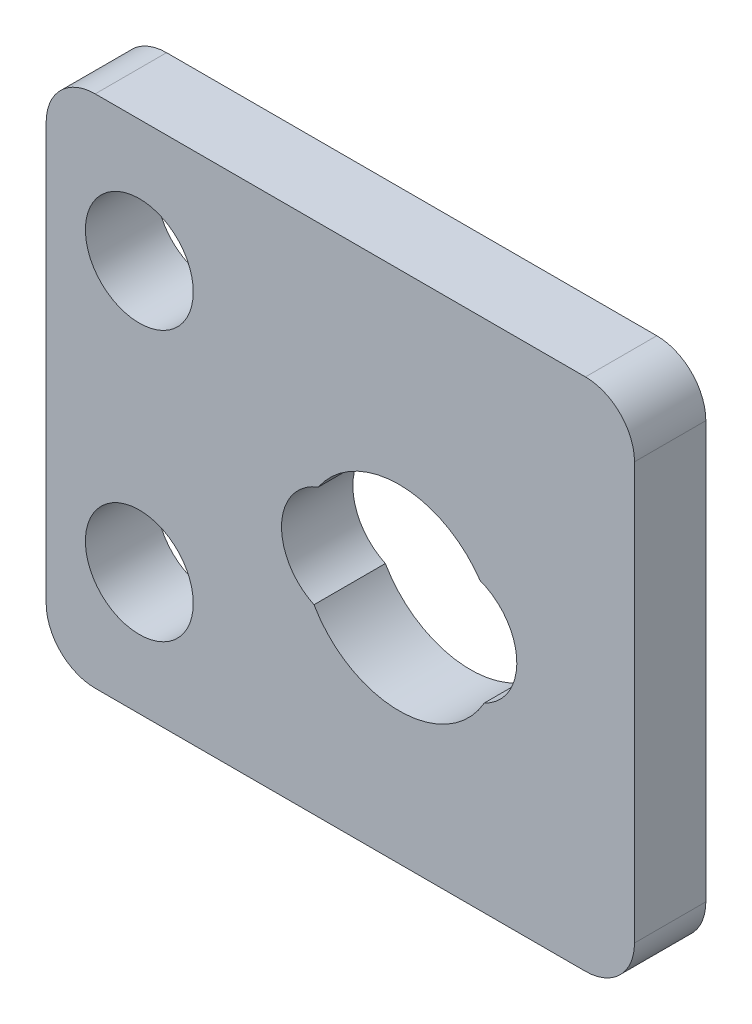
ISO-10303-21;
HEADER;
FILE_DESCRIPTION(('STEP AP214'),'2;1');
FILE_NAME('part.step','',(''),(''),'','','');
FILE_SCHEMA(('AUTOMOTIVE_DESIGN { 1 0 10303 214 1 1 1 1 }'));
ENDSEC;
DATA;
#1=APPLICATION_CONTEXT('core data for automotive mechanical design processes');
#2=APPLICATION_PROTOCOL_DEFINITION('international standard','automotive_design',2000,#1);
#3=PRODUCT_CONTEXT('',#1,'mechanical');
#4=PRODUCT('Part','Part','',(#3));
#5=PRODUCT_RELATED_PRODUCT_CATEGORY('part','',(#4));
#6=PRODUCT_DEFINITION_FORMATION('','',#4);
#7=PRODUCT_DEFINITION_CONTEXT('part definition',#1,'design');
#8=PRODUCT_DEFINITION('design','',#6,#7);
#9=PRODUCT_DEFINITION_SHAPE('','',#8);
#10=(LENGTH_UNIT() NAMED_UNIT(*) SI_UNIT(.MILLI.,.METRE.));
#11=(NAMED_UNIT(*) PLANE_ANGLE_UNIT() SI_UNIT($,.RADIAN.));
#12=(NAMED_UNIT(*) SI_UNIT($,.STERADIAN.) SOLID_ANGLE_UNIT());
#13=UNCERTAINTY_MEASURE_WITH_UNIT(LENGTH_MEASURE(1.E-05),#10,'distance_accuracy_value','');
#14=(GEOMETRIC_REPRESENTATION_CONTEXT(3) GLOBAL_UNCERTAINTY_ASSIGNED_CONTEXT((#13)) GLOBAL_UNIT_ASSIGNED_CONTEXT((#10,
#11,#12)) REPRESENTATION_CONTEXT('',''));
#15=CARTESIAN_POINT('',(0.,0.,0.));
#16=DIRECTION('',(0.,0.,1.));
#17=DIRECTION('',(1.,0.,0.));
#18=AXIS2_PLACEMENT_3D('',#15,#16,#17);
#19=CARTESIAN_POINT('',(-63.6058315526219,-52.4736097758341,80.3472714906711));
#20=DIRECTION('',(0.,0.,-1.));
#21=DIRECTION('',(-1.,0.,0.));
#22=AXIS2_PLACEMENT_3D('',#19,#20,#21);
#23=PLANE('',#22);
#24=CARTESIAN_POINT('',(-60.1558315526219,-58.2236097758341,80.3472714906711));
#25=DIRECTION('',(0.,0.,1.));
#26=DIRECTION('',(1.,0.,0.));
#27=AXIS2_PLACEMENT_3D('',#24,#25,#26);
#28=CIRCLE('',#27,1.15);
#29=CARTESIAN_POINT('',(-60.557732115266,-57.1461238419369,80.3472714906711));
#30=VERTEX_POINT('',#29);
#31=CARTESIAN_POINT('',(-60.6425092647382,-59.2655525787409,80.3472714906711));
#32=VERTEX_POINT('',#31);
#33=EDGE_CURVE('E133',#30,#32,#28,.T.);
#34=ORIENTED_EDGE('',*,*,#33,.F.);
#35=CARTESIAN_POINT('',(-58.9058315526219,-58.2736097758341,80.3472714906711));
#36=DIRECTION('',(0.,0.,-1.));
#37=DIRECTION('',(-1.,0.,0.));
#38=AXIS2_PLACEMENT_3D('',#35,#36,#37);
#39=CIRCLE('',#38,2.);
#40=CARTESIAN_POINT('',(-57.2539309899778,-57.1461238419369,80.3472714906711));
#41=VERTEX_POINT('',#40);
#42=EDGE_CURVE('E136',#41,#30,#39,.F.);
#43=ORIENTED_EDGE('',*,*,#42,.F.);
#44=CARTESIAN_POINT('',(-57.6558315526219,-58.2236097758341,80.3472714906711));
#45=DIRECTION('',(0.,0.,1.));
#46=DIRECTION('',(1.,0.,0.));
#47=AXIS2_PLACEMENT_3D('',#44,#45,#46);
#48=CIRCLE('',#47,1.15);
#49=CARTESIAN_POINT('',(-57.1691538405056,-59.2655525787409,80.3472714906711));
#50=VERTEX_POINT('',#49);
#51=EDGE_CURVE('E135',#50,#41,#48,.T.);
#52=ORIENTED_EDGE('',*,*,#51,.F.);
#53=EDGE_CURVE('E55',#32,#50,#39,.F.);
#54=ORIENTED_EDGE('',*,*,#53,.F.);
#55=EDGE_LOOP('',(#34,#43,#52,#54));
#56=FACE_BOUND('',#55,.T.);
#57=CARTESIAN_POINT('',(-64.2058315526219,-54.9736097758341,80.3472714906711));
#58=DIRECTION('',(0.,0.,1.));
#59=DIRECTION('',(1.,0.,0.));
#60=AXIS2_PLACEMENT_3D('',#57,#58,#59);
#61=CIRCLE('',#60,1.10000000000001);
#62=CARTESIAN_POINT('',(-63.1058315526219,-54.9736097758341,80.3472714906711));
#63=VERTEX_POINT('',#62);
#64=EDGE_CURVE('E142',#63,#63,#61,.T.);
#65=ORIENTED_EDGE('',*,*,#64,.F.);
#66=EDGE_LOOP('',(#65));
#67=FACE_BOUND('',#66,.T.);
#68=CARTESIAN_POINT('',(-64.2058315526219,-60.4736097758341,80.3472714906711));
#69=DIRECTION('',(0.,0.,1.));
#70=DIRECTION('',(1.,0.,0.));
#71=AXIS2_PLACEMENT_3D('',#68,#69,#70);
#72=CIRCLE('',#71,1.10000000000001);
#73=CARTESIAN_POINT('',(-63.1058315526219,-60.4736097758341,80.3472714906711));
#74=VERTEX_POINT('',#73);
#75=EDGE_CURVE('E151',#74,#74,#72,.T.);
#76=ORIENTED_EDGE('',*,*,#75,.F.);
#77=EDGE_LOOP('',(#76));
#78=FACE_BOUND('',#77,.T.);
#79=DIRECTION('',(1.,0.,0.));
#80=VECTOR('',#79,1.);
#81=CARTESIAN_POINT('',(-63.6058315526219,-62.9736097758341,80.3472714906711));
#82=LINE('',#81,#80);
#83=CARTESIAN_POINT('',(-65.1058315526219,-62.9736097758341,80.3472714906711));
#84=VERTEX_POINT('',#83);
#85=CARTESIAN_POINT('',(-55.1058315526219,-62.9736097758341,80.3472714906711));
#86=VERTEX_POINT('',#85);
#87=EDGE_CURVE('E159',#84,#86,#82,.T.);
#88=ORIENTED_EDGE('',*,*,#87,.T.);
#89=CARTESIAN_POINT('',(-55.1058315526219,-61.9736097758341,80.3472714906711));
#90=DIRECTION('',(0.,0.,-1.));
#91=DIRECTION('',(-1.,0.,0.));
#92=AXIS2_PLACEMENT_3D('',#89,#90,#91);
#93=CIRCLE('',#92,1.);
#94=CARTESIAN_POINT('',(-54.1058315526219,-61.9736097758341,80.3472714906711));
#95=VERTEX_POINT('',#94);
#96=EDGE_CURVE('E184',#86,#95,#93,.F.);
#97=ORIENTED_EDGE('',*,*,#96,.T.);
#98=DIRECTION('',(0.,-1.,0.));
#99=VECTOR('',#98,1.);
#100=CARTESIAN_POINT('',(-54.1058315526219,-52.4736097758341,80.3472714906711));
#101=LINE('',#100,#99);
#102=CARTESIAN_POINT('',(-54.1058315526219,-53.4736097758341,80.3472714906711));
#103=VERTEX_POINT('',#102);
#104=EDGE_CURVE('E163',#103,#95,#101,.T.);
#105=ORIENTED_EDGE('',*,*,#104,.F.);
#106=CARTESIAN_POINT('',(-55.1058315526219,-53.4736097758341,80.3472714906711));
#107=DIRECTION('',(0.,0.,-1.));
#108=DIRECTION('',(-1.,0.,0.));
#109=AXIS2_PLACEMENT_3D('',#106,#107,#108);
#110=CIRCLE('',#109,1.);
#111=CARTESIAN_POINT('',(-55.1058315526219,-52.4736097758341,80.3472714906711));
#112=VERTEX_POINT('',#111);
#113=EDGE_CURVE('E178',#103,#112,#110,.F.);
#114=ORIENTED_EDGE('',*,*,#113,.T.);
#115=DIRECTION('',(1.,0.,0.));
#116=VECTOR('',#115,1.);
#117=CARTESIAN_POINT('',(-63.6058315526219,-52.4736097758341,80.3472714906711));
#118=LINE('',#117,#116);
#119=CARTESIAN_POINT('',(-65.1058315526219,-52.4736097758341,80.3472714906711));
#120=VERTEX_POINT('',#119);
#121=EDGE_CURVE('E160',#120,#112,#118,.T.);
#122=ORIENTED_EDGE('',*,*,#121,.F.);
#123=CARTESIAN_POINT('',(-65.1058315526219,-53.4736097758341,80.3472714906711));
#124=DIRECTION('',(0.,0.,-1.));
#125=DIRECTION('',(-1.,0.,0.));
#126=AXIS2_PLACEMENT_3D('',#123,#124,#125);
#127=CIRCLE('',#126,1.);
#128=CARTESIAN_POINT('',(-66.1058315526219,-53.4736097758341,80.3472714906711));
#129=VERTEX_POINT('',#128);
#130=EDGE_CURVE('E180',#120,#129,#127,.F.);
#131=ORIENTED_EDGE('',*,*,#130,.T.);
#132=DIRECTION('',(0.,1.,0.));
#133=VECTOR('',#132,1.);
#134=CARTESIAN_POINT('',(-66.1058315526219,-52.4736097758341,80.3472714906711));
#135=LINE('',#134,#133);
#136=CARTESIAN_POINT('',(-66.1058315526219,-61.9736097758341,80.3472714906711));
#137=VERTEX_POINT('',#136);
#138=EDGE_CURVE('E154',#137,#129,#135,.T.);
#139=ORIENTED_EDGE('',*,*,#138,.F.);
#140=CARTESIAN_POINT('',(-65.1058315526219,-61.9736097758341,80.3472714906711));
#141=DIRECTION('',(0.,0.,-1.));
#142=DIRECTION('',(-1.,0.,0.));
#143=AXIS2_PLACEMENT_3D('',#140,#141,#142);
#144=CIRCLE('',#143,1.);
#145=EDGE_CURVE('E182',#137,#84,#144,.F.);
#146=ORIENTED_EDGE('',*,*,#145,.T.);
#147=EDGE_LOOP('',(#88,#97,#105,#114,#122,#131,#139,#146));
#148=FACE_BOUND('',#147,.T.);
#149=ADVANCED_FACE('F32',(#56,#67,#78,#148),#23,.F.);
#150=CARTESIAN_POINT('',(-54.1058315526219,-52.4736097758341,76.3472714906711));
#151=DIRECTION('',(-1.,0.,0.));
#152=DIRECTION('',(0.,0.,1.));
#153=AXIS2_PLACEMENT_3D('',#150,#151,#152);
#154=PLANE('',#153);
#155=DIRECTION('',(0.,0.,-1.));
#156=VECTOR('',#155,1.);
#157=CARTESIAN_POINT('',(-54.1058315526219,-61.9736097758341,76.3472714906711));
#158=LINE('',#157,#156);
#159=CARTESIAN_POINT('',(-54.1058315526219,-61.9736097758341,78.892108041937));
#160=VERTEX_POINT('',#159);
#161=EDGE_CURVE('E170',#95,#160,#158,.T.);
#162=ORIENTED_EDGE('',*,*,#161,.T.);
#163=DIRECTION('',(0.,-1.,0.));
#164=VECTOR('',#163,1.);
#165=CARTESIAN_POINT('',(-54.1058315526219,-61.9736097758341,78.892108041937));
#166=LINE('',#165,#164);
#167=CARTESIAN_POINT('',(-54.1058315526219,-53.4736097758341,78.892108041937));
#168=VERTEX_POINT('',#167);
#169=EDGE_CURVE('E211',#168,#160,#166,.T.);
#170=ORIENTED_EDGE('',*,*,#169,.F.);
#171=DIRECTION('',(0.,0.,-1.));
#172=VECTOR('',#171,1.);
#173=CARTESIAN_POINT('',(-54.1058315526219,-53.4736097758341,80.3472714906711));
#174=LINE('',#173,#172);
#175=EDGE_CURVE('E168',#168,#103,#174,.F.);
#176=ORIENTED_EDGE('',*,*,#175,.T.);
#177=ORIENTED_EDGE('',*,*,#104,.T.);
#178=EDGE_LOOP('',(#162,#170,#176,#177));
#179=FACE_BOUND('',#178,.T.);
#180=ADVANCED_FACE('F244',(#179),#154,.F.);
#181=CARTESIAN_POINT('',(-63.6058315526219,-52.4736097758341,76.3472714906711));
#182=DIRECTION('',(0.,1.,0.));
#183=DIRECTION('',(0.,0.,1.));
#184=AXIS2_PLACEMENT_3D('',#181,#182,#183);
#185=PLANE('',#184);
#186=DIRECTION('',(1.,0.,0.));
#187=VECTOR('',#186,1.);
#188=CARTESIAN_POINT('',(-55.3558315526219,-52.4736097758341,78.892108041937));
#189=LINE('',#188,#187);
#190=CARTESIAN_POINT('',(-65.1058315526219,-52.4736097758341,78.892108041937));
#191=VERTEX_POINT('',#190);
#192=CARTESIAN_POINT('',(-55.1058315526219,-52.4736097758341,78.892108041937));
#193=VERTEX_POINT('',#192);
#194=EDGE_CURVE('E157',#191,#193,#189,.T.);
#195=ORIENTED_EDGE('',*,*,#194,.F.);
#196=DIRECTION('',(0.,0.,-1.));
#197=VECTOR('',#196,1.);
#198=CARTESIAN_POINT('',(-65.1058315526219,-52.4736097758341,76.3472714906711));
#199=LINE('',#198,#197);
#200=EDGE_CURVE('E194',#191,#120,#199,.F.);
#201=ORIENTED_EDGE('',*,*,#200,.T.);
#202=ORIENTED_EDGE('',*,*,#121,.T.);
#203=DIRECTION('',(0.,0.,-1.));
#204=VECTOR('',#203,1.);
#205=CARTESIAN_POINT('',(-55.1058315526219,-52.4736097758341,76.3472714906711));
#206=LINE('',#205,#204);
#207=EDGE_CURVE('E191',#112,#193,#206,.T.);
#208=ORIENTED_EDGE('',*,*,#207,.T.);
#209=EDGE_LOOP('',(#195,#201,#202,#208));
#210=FACE_BOUND('',#209,.T.);
#211=ADVANCED_FACE('F267',(#210),#185,.T.);
#212=CARTESIAN_POINT('',(-63.6058315526219,-62.9736097758341,76.3472714906711));
#213=DIRECTION('',(0.,1.,0.));
#214=DIRECTION('',(0.,0.,1.));
#215=AXIS2_PLACEMENT_3D('',#212,#213,#214);
#216=PLANE('',#215);
#217=DIRECTION('',(0.,0.,1.));
#218=VECTOR('',#217,1.);
#219=CARTESIAN_POINT('',(-65.1058315526219,-62.9736097758341,76.3472714906711));
#220=LINE('',#219,#218);
#221=CARTESIAN_POINT('',(-65.1058315526219,-62.9736097758341,78.892108041937));
#222=VERTEX_POINT('',#221);
#223=EDGE_CURVE('E173',#84,#222,#220,.F.);
#224=ORIENTED_EDGE('',*,*,#223,.T.);
#225=DIRECTION('',(-1.,0.,0.));
#226=VECTOR('',#225,1.);
#227=CARTESIAN_POINT('',(-65.1058315526219,-62.9736097758341,78.892108041937));
#228=LINE('',#227,#226);
#229=CARTESIAN_POINT('',(-55.1058315526219,-62.9736097758341,78.892108041937));
#230=VERTEX_POINT('',#229);
#231=EDGE_CURVE('E219',#230,#222,#228,.T.);
#232=ORIENTED_EDGE('',*,*,#231,.F.);
#233=DIRECTION('',(0.,0.,-1.));
#234=VECTOR('',#233,1.);
#235=CARTESIAN_POINT('',(-55.1058315526219,-62.9736097758341,76.3472714906711));
#236=LINE('',#235,#234);
#237=EDGE_CURVE('E176',#230,#86,#236,.F.);
#238=ORIENTED_EDGE('',*,*,#237,.T.);
#239=ORIENTED_EDGE('',*,*,#87,.F.);
#240=EDGE_LOOP('',(#224,#232,#238,#239));
#241=FACE_BOUND('',#240,.T.);
#242=ADVANCED_FACE('F231',(#241),#216,.F.);
#243=CARTESIAN_POINT('',(-55.3558315526219,-61.9736097758341,78.892108041937));
#244=DIRECTION('',(0.,0.,1.));
#245=DIRECTION('',(1.,0.,0.));
#246=AXIS2_PLACEMENT_3D('',#243,#244,#245);
#247=PLANE('',#246);
#248=ORIENTED_EDGE('',*,*,#194,.T.);
#249=CARTESIAN_POINT('',(-55.1058315526219,-53.4736097758341,78.892108041937));
#250=DIRECTION('',(0.,0.,1.));
#251=DIRECTION('',(1.,0.,0.));
#252=AXIS2_PLACEMENT_3D('',#249,#250,#251);
#253=CIRCLE('',#252,1.);
#254=EDGE_CURVE('E196',#193,#168,#253,.F.);
#255=ORIENTED_EDGE('',*,*,#254,.T.);
#256=ORIENTED_EDGE('',*,*,#169,.T.);
#257=CARTESIAN_POINT('',(-55.1058315526219,-61.9736097758341,78.892108041937));
#258=DIRECTION('',(0.,0.,1.));
#259=DIRECTION('',(1.,0.,0.));
#260=AXIS2_PLACEMENT_3D('',#257,#258,#259);
#261=CIRCLE('',#260,0.999999999999994);
#262=EDGE_CURVE('E221',#160,#230,#261,.F.);
#263=ORIENTED_EDGE('',*,*,#262,.T.);
#264=ORIENTED_EDGE('',*,*,#231,.T.);
#265=CARTESIAN_POINT('',(-65.1058315526219,-61.9736097758341,78.892108041937));
#266=DIRECTION('',(0.,0.,1.));
#267=DIRECTION('',(1.,0.,0.));
#268=AXIS2_PLACEMENT_3D('',#265,#266,#267);
#269=CIRCLE('',#268,1.00000000000001);
#270=CARTESIAN_POINT('',(-66.1058315526219,-61.9736097758341,78.892108041937));
#271=VERTEX_POINT('',#270);
#272=EDGE_CURVE('E217',#222,#271,#269,.F.);
#273=ORIENTED_EDGE('',*,*,#272,.T.);
#274=DIRECTION('',(0.,1.,0.));
#275=VECTOR('',#274,1.);
#276=CARTESIAN_POINT('',(-66.1058315526219,-53.4736097758341,78.892108041937));
#277=LINE('',#276,#275);
#278=CARTESIAN_POINT('',(-66.1058315526219,-53.4736097758341,78.892108041937));
#279=VERTEX_POINT('',#278);
#280=EDGE_CURVE('E215',#271,#279,#277,.T.);
#281=ORIENTED_EDGE('',*,*,#280,.T.);
#282=CARTESIAN_POINT('',(-65.1058315526219,-53.4736097758341,78.892108041937));
#283=DIRECTION('',(0.,0.,1.));
#284=DIRECTION('',(1.,0.,0.));
#285=AXIS2_PLACEMENT_3D('',#282,#283,#284);
#286=CIRCLE('',#285,0.999999999999997);
#287=EDGE_CURVE('E212',#279,#191,#286,.F.);
#288=ORIENTED_EDGE('',*,*,#287,.T.);
#289=EDGE_LOOP('',(#248,#255,#256,#263,#264,#273,#281,#288));
#290=FACE_BOUND('',#289,.T.);
#291=CARTESIAN_POINT('',(-57.6558315526219,-58.2236097758341,78.892108041937));
#292=DIRECTION('',(0.,0.,1.));
#293=DIRECTION('',(1.,0.,0.));
#294=AXIS2_PLACEMENT_3D('',#291,#292,#293);
#295=CIRCLE('',#294,1.15);
#296=CARTESIAN_POINT('',(-57.1691538405056,-59.2655525787409,78.892108041937));
#297=VERTEX_POINT('',#296);
#298=CARTESIAN_POINT('',(-57.2539309899778,-57.1461238419369,78.892108041937));
#299=VERTEX_POINT('',#298);
#300=EDGE_CURVE('E198',#297,#299,#295,.T.);
#301=ORIENTED_EDGE('',*,*,#300,.T.);
#302=CARTESIAN_POINT('',(-58.9058315526219,-58.2736097758341,78.892108041937));
#303=DIRECTION('',(0.,0.,-1.));
#304=DIRECTION('',(-1.,0.,0.));
#305=AXIS2_PLACEMENT_3D('',#302,#303,#304);
#306=CIRCLE('',#305,2.);
#307=CARTESIAN_POINT('',(-60.557732115266,-57.1461238419369,78.892108041937));
#308=VERTEX_POINT('',#307);
#309=EDGE_CURVE('E47',#308,#299,#306,.T.);
#310=ORIENTED_EDGE('',*,*,#309,.F.);
#311=CARTESIAN_POINT('',(-60.1558315526219,-58.2236097758341,78.892108041937));
#312=DIRECTION('',(0.,0.,1.));
#313=DIRECTION('',(1.,0.,0.));
#314=AXIS2_PLACEMENT_3D('',#311,#312,#313);
#315=CIRCLE('',#314,1.15);
#316=CARTESIAN_POINT('',(-60.6425092647382,-59.2655525787409,78.892108041937));
#317=VERTEX_POINT('',#316);
#318=EDGE_CURVE('E201',#308,#317,#315,.T.);
#319=ORIENTED_EDGE('',*,*,#318,.T.);
#320=EDGE_CURVE('E121',#297,#317,#306,.T.);
#321=ORIENTED_EDGE('',*,*,#320,.F.);
#322=EDGE_LOOP('',(#301,#310,#319,#321));
#323=FACE_BOUND('',#322,.T.);
#324=CARTESIAN_POINT('',(-64.2058315526219,-54.9736097758341,78.892108041937));
#325=DIRECTION('',(0.,0.,1.));
#326=DIRECTION('',(1.,0.,0.));
#327=AXIS2_PLACEMENT_3D('',#324,#325,#326);
#328=CIRCLE('',#327,1.10000000000001);
#329=CARTESIAN_POINT('',(-63.1058315526219,-54.9736097758341,78.892108041937));
#330=VERTEX_POINT('',#329);
#331=EDGE_CURVE('E145',#330,#330,#328,.F.);
#332=ORIENTED_EDGE('',*,*,#331,.F.);
#333=EDGE_LOOP('',(#332));
#334=FACE_BOUND('',#333,.T.);
#335=CARTESIAN_POINT('',(-64.2058315526219,-60.4736097758341,78.892108041937));
#336=DIRECTION('',(0.,0.,1.));
#337=DIRECTION('',(1.,0.,0.));
#338=AXIS2_PLACEMENT_3D('',#335,#336,#337);
#339=CIRCLE('',#338,1.10000000000001);
#340=CARTESIAN_POINT('',(-63.1058315526219,-60.4736097758341,78.892108041937));
#341=VERTEX_POINT('',#340);
#342=EDGE_CURVE('E140',#341,#341,#339,.F.);
#343=ORIENTED_EDGE('',*,*,#342,.F.);
#344=EDGE_LOOP('',(#343));
#345=FACE_BOUND('',#344,.T.);
#346=ADVANCED_FACE('F206',(#290,#323,#334,#345),#247,.F.);
#347=CARTESIAN_POINT('',(-66.1058315526219,-62.9736097758341,76.3472714906711));
#348=DIRECTION('',(-1.,0.,0.));
#349=DIRECTION('',(0.,0.,1.));
#350=AXIS2_PLACEMENT_3D('',#347,#348,#349);
#351=PLANE('',#350);
#352=ORIENTED_EDGE('',*,*,#280,.F.);
#353=DIRECTION('',(0.,0.,1.));
#354=VECTOR('',#353,1.);
#355=CARTESIAN_POINT('',(-66.1058315526219,-61.9736097758341,80.3472714906711));
#356=LINE('',#355,#354);
#357=EDGE_CURVE('E189',#271,#137,#356,.T.);
#358=ORIENTED_EDGE('',*,*,#357,.T.);
#359=ORIENTED_EDGE('',*,*,#138,.T.);
#360=DIRECTION('',(0.,0.,-1.));
#361=VECTOR('',#360,1.);
#362=CARTESIAN_POINT('',(-66.1058315526219,-53.4736097758341,76.3472714906711));
#363=LINE('',#362,#361);
#364=EDGE_CURVE('E186',#129,#279,#363,.T.);
#365=ORIENTED_EDGE('',*,*,#364,.T.);
#366=EDGE_LOOP('',(#352,#358,#359,#365));
#367=FACE_BOUND('',#366,.T.);
#368=ADVANCED_FACE('F230',(#367),#351,.T.);
#369=CARTESIAN_POINT('',(-55.1058315526219,-61.9736097758341,76.3472714906711));
#370=DIRECTION('',(0.,0.,-1.));
#371=DIRECTION('',(-1.,0.,0.));
#372=AXIS2_PLACEMENT_3D('',#369,#370,#371);
#373=CYLINDRICAL_SURFACE('',#372,1.);
#374=ORIENTED_EDGE('',*,*,#262,.F.);
#375=ORIENTED_EDGE('',*,*,#161,.F.);
#376=ORIENTED_EDGE('',*,*,#96,.F.);
#377=ORIENTED_EDGE('',*,*,#237,.F.);
#378=EDGE_LOOP('',(#374,#375,#376,#377));
#379=FACE_BOUND('',#378,.T.);
#380=ADVANCED_FACE('F257',(#379),#373,.T.);
#381=CARTESIAN_POINT('',(-65.1058315526219,-61.9736097758341,76.3472714906711));
#382=DIRECTION('',(0.,0.,-1.));
#383=DIRECTION('',(-1.,0.,0.));
#384=AXIS2_PLACEMENT_3D('',#381,#382,#383);
#385=CYLINDRICAL_SURFACE('',#384,1.);
#386=ORIENTED_EDGE('',*,*,#272,.F.);
#387=ORIENTED_EDGE('',*,*,#223,.F.);
#388=ORIENTED_EDGE('',*,*,#145,.F.);
#389=ORIENTED_EDGE('',*,*,#357,.F.);
#390=EDGE_LOOP('',(#386,#387,#388,#389));
#391=FACE_BOUND('',#390,.T.);
#392=ADVANCED_FACE('F279',(#391),#385,.T.);
#393=CARTESIAN_POINT('',(-65.1058315526219,-53.4736097758341,76.3472714906711));
#394=DIRECTION('',(0.,0.,-1.));
#395=DIRECTION('',(-1.,0.,0.));
#396=AXIS2_PLACEMENT_3D('',#393,#394,#395);
#397=CYLINDRICAL_SURFACE('',#396,1.);
#398=ORIENTED_EDGE('',*,*,#287,.F.);
#399=ORIENTED_EDGE('',*,*,#364,.F.);
#400=ORIENTED_EDGE('',*,*,#130,.F.);
#401=ORIENTED_EDGE('',*,*,#200,.F.);
#402=EDGE_LOOP('',(#398,#399,#400,#401));
#403=FACE_BOUND('',#402,.T.);
#404=ADVANCED_FACE('F273',(#403),#397,.T.);
#405=CARTESIAN_POINT('',(-55.1058315526219,-53.4736097758341,76.3472714906711));
#406=DIRECTION('',(0.,0.,1.));
#407=DIRECTION('',(1.,0.,0.));
#408=AXIS2_PLACEMENT_3D('',#405,#406,#407);
#409=CYLINDRICAL_SURFACE('',#408,1.);
#410=ORIENTED_EDGE('',*,*,#175,.F.);
#411=ORIENTED_EDGE('',*,*,#254,.F.);
#412=ORIENTED_EDGE('',*,*,#207,.F.);
#413=ORIENTED_EDGE('',*,*,#113,.F.);
#414=EDGE_LOOP('',(#410,#411,#412,#413));
#415=FACE_BOUND('',#414,.T.);
#416=ADVANCED_FACE('F34',(#415),#409,.T.);
#417=CARTESIAN_POINT('',(-64.2058315526219,-60.4736097758341,80.3472714906711));
#418=DIRECTION('',(0.,0.,1.));
#419=DIRECTION('',(1.,0.,0.));
#420=AXIS2_PLACEMENT_3D('',#417,#418,#419);
#421=CYLINDRICAL_SURFACE('',#420,1.10000000000001);
#422=ORIENTED_EDGE('',*,*,#342,.T.);
#423=EDGE_LOOP('',(#422));
#424=FACE_BOUND('',#423,.T.);
#425=ORIENTED_EDGE('',*,*,#75,.T.);
#426=EDGE_LOOP('',(#425));
#427=FACE_BOUND('',#426,.T.);
#428=ADVANCED_FACE('F236',(#424,#427),#421,.F.);
#429=CARTESIAN_POINT('',(-64.2058315526219,-54.9736097758341,80.3472714906711));
#430=DIRECTION('',(0.,0.,1.));
#431=DIRECTION('',(1.,0.,0.));
#432=AXIS2_PLACEMENT_3D('',#429,#430,#431);
#433=CYLINDRICAL_SURFACE('',#432,1.10000000000001);
#434=ORIENTED_EDGE('',*,*,#331,.T.);
#435=EDGE_LOOP('',(#434));
#436=FACE_BOUND('',#435,.T.);
#437=ORIENTED_EDGE('',*,*,#64,.T.);
#438=EDGE_LOOP('',(#437));
#439=FACE_BOUND('',#438,.T.);
#440=ADVANCED_FACE('F226',(#436,#439),#433,.F.);
#441=CARTESIAN_POINT('',(-60.1558315526219,-58.2236097758341,78.8872714906711));
#442=DIRECTION('',(0.,0.,1.));
#443=DIRECTION('',(1.,0.,0.));
#444=AXIS2_PLACEMENT_3D('',#441,#442,#443);
#445=CYLINDRICAL_SURFACE('',#444,1.15);
#446=ORIENTED_EDGE('',*,*,#318,.F.);
#447=DIRECTION('',(0.,0.,-1.));
#448=VECTOR('',#447,1.);
#449=CARTESIAN_POINT('',(-60.557732115266,-57.1461238419369,79.6196897663041));
#450=LINE('',#449,#448);
#451=EDGE_CURVE('E126',#308,#30,#450,.F.);
#452=ORIENTED_EDGE('',*,*,#451,.T.);
#453=ORIENTED_EDGE('',*,*,#33,.T.);
#454=DIRECTION('',(0.,0.,-1.));
#455=VECTOR('',#454,1.);
#456=CARTESIAN_POINT('',(-60.6425092647382,-59.2655525787409,79.6196897663041));
#457=LINE('',#456,#455);
#458=EDGE_CURVE('E118',#32,#317,#457,.T.);
#459=ORIENTED_EDGE('',*,*,#458,.T.);
#460=EDGE_LOOP('',(#446,#452,#453,#459));
#461=FACE_BOUND('',#460,.T.);
#462=ADVANCED_FACE('F139',(#461),#445,.F.);
#463=CARTESIAN_POINT('',(-57.6558315526219,-58.2236097758341,78.8872714906711));
#464=DIRECTION('',(0.,0.,1.));
#465=DIRECTION('',(1.,0.,0.));
#466=AXIS2_PLACEMENT_3D('',#463,#464,#465);
#467=CYLINDRICAL_SURFACE('',#466,1.15);
#468=ORIENTED_EDGE('',*,*,#300,.F.);
#469=DIRECTION('',(0.,0.,-1.));
#470=VECTOR('',#469,1.);
#471=CARTESIAN_POINT('',(-57.1691538405056,-59.2655525787409,79.6196897663041));
#472=LINE('',#471,#470);
#473=EDGE_CURVE('E11',#297,#50,#472,.F.);
#474=ORIENTED_EDGE('',*,*,#473,.T.);
#475=ORIENTED_EDGE('',*,*,#51,.T.);
#476=DIRECTION('',(0.,0.,-1.));
#477=VECTOR('',#476,1.);
#478=CARTESIAN_POINT('',(-57.2539309899778,-57.1461238419369,79.6196897663041));
#479=LINE('',#478,#477);
#480=EDGE_CURVE('E40',#41,#299,#479,.T.);
#481=ORIENTED_EDGE('',*,*,#480,.T.);
#482=EDGE_LOOP('',(#468,#474,#475,#481));
#483=FACE_BOUND('',#482,.T.);
#484=ADVANCED_FACE('F204',(#483),#467,.F.);
#485=CARTESIAN_POINT('',(-58.9058315526219,-58.2736097758341,86.0041257401635));
#486=DIRECTION('',(0.,0.,-1.));
#487=DIRECTION('',(-1.,0.,0.));
#488=AXIS2_PLACEMENT_3D('',#485,#486,#487);
#489=CYLINDRICAL_SURFACE('',#488,2.);
#490=ORIENTED_EDGE('',*,*,#309,.T.);
#491=ORIENTED_EDGE('',*,*,#480,.F.);
#492=ORIENTED_EDGE('',*,*,#42,.T.);
#493=ORIENTED_EDGE('',*,*,#451,.F.);
#494=EDGE_LOOP('',(#490,#491,#492,#493));
#495=FACE_BOUND('',#494,.T.);
#496=ADVANCED_FACE('F323',(#495),#489,.F.);
#497=ORIENTED_EDGE('',*,*,#53,.T.);
#498=ORIENTED_EDGE('',*,*,#473,.F.);
#499=ORIENTED_EDGE('',*,*,#320,.T.);
#500=ORIENTED_EDGE('',*,*,#458,.F.);
#501=EDGE_LOOP('',(#497,#498,#499,#500));
#502=FACE_BOUND('',#501,.T.);
#503=ADVANCED_FACE('F119',(#502),#489,.F.);
#504=CLOSED_SHELL('',(#149,#180,#211,#242,#346,#368,#380,#392,#404,#416,#428,#440,#462,#484,
#496,#503));
#505=MANIFOLD_SOLID_BREP('B2',#504);
#506=ADVANCED_BREP_SHAPE_REPRESENTATION('',(#18,#505),#14);
#507=SHAPE_DEFINITION_REPRESENTATION(#9,#506);
ENDSEC;
END-ISO-10303-21;
